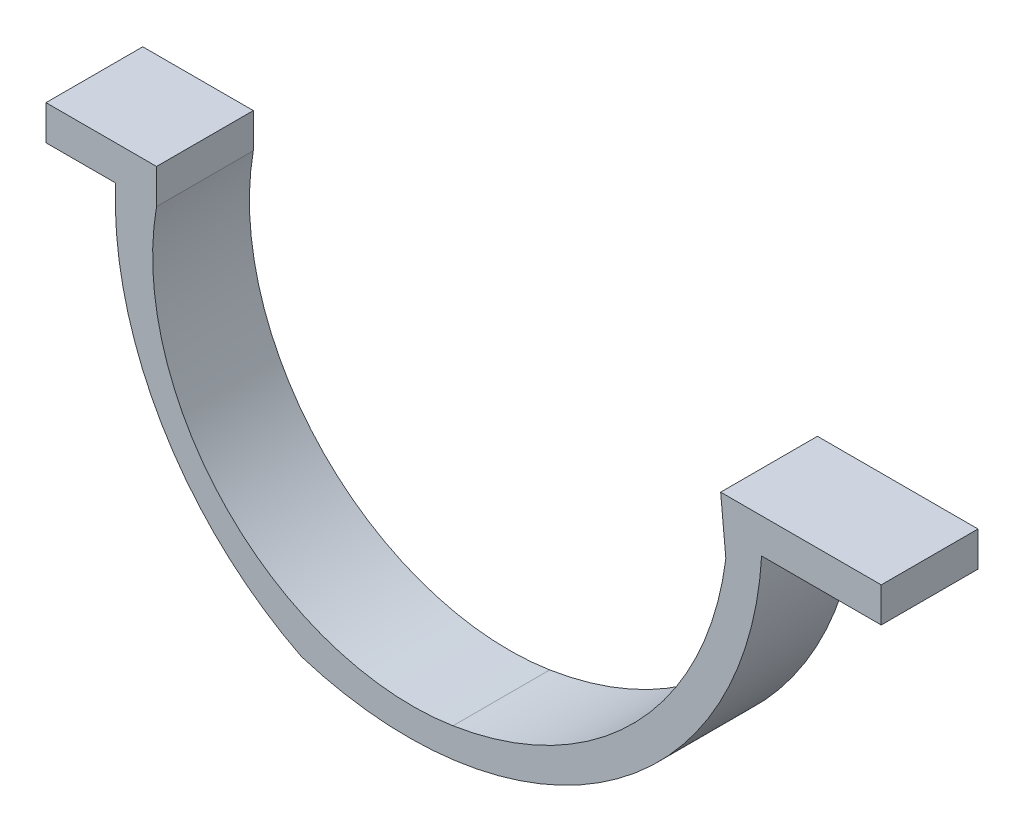
ISO-10303-21;
HEADER;
FILE_DESCRIPTION(('STEP AP214'),'2;1');
FILE_NAME('part.step','',(''),(''),'','','');
FILE_SCHEMA(('AUTOMOTIVE_DESIGN { 1 0 10303 214 1 1 1 1 }'));
ENDSEC;
DATA;
#1=APPLICATION_CONTEXT('core data for automotive mechanical design processes');
#2=APPLICATION_PROTOCOL_DEFINITION('international standard','automotive_design',2000,#1);
#3=PRODUCT_CONTEXT('',#1,'mechanical');
#4=PRODUCT('Part','Part','',(#3));
#5=PRODUCT_RELATED_PRODUCT_CATEGORY('part','',(#4));
#6=PRODUCT_DEFINITION_FORMATION('','',#4);
#7=PRODUCT_DEFINITION_CONTEXT('part definition',#1,'design');
#8=PRODUCT_DEFINITION('design','',#6,#7);
#9=PRODUCT_DEFINITION_SHAPE('','',#8);
#10=(LENGTH_UNIT() NAMED_UNIT(*) SI_UNIT(.MILLI.,.METRE.));
#11=(NAMED_UNIT(*) PLANE_ANGLE_UNIT() SI_UNIT($,.RADIAN.));
#12=(NAMED_UNIT(*) SI_UNIT($,.STERADIAN.) SOLID_ANGLE_UNIT());
#13=UNCERTAINTY_MEASURE_WITH_UNIT(LENGTH_MEASURE(1.E-05),#10,'distance_accuracy_value','');
#14=(GEOMETRIC_REPRESENTATION_CONTEXT(3) GLOBAL_UNCERTAINTY_ASSIGNED_CONTEXT((#13)) GLOBAL_UNIT_ASSIGNED_CONTEXT((#10,
#11,#12)) REPRESENTATION_CONTEXT('',''));
#15=CARTESIAN_POINT('',(0.,0.,0.));
#16=DIRECTION('',(0.,0.,1.));
#17=DIRECTION('',(1.,0.,0.));
#18=AXIS2_PLACEMENT_3D('',#15,#16,#17);
#19=CARTESIAN_POINT('',(-36.5486904215204,2.13660271873455,5.));
#20=DIRECTION('',(0.,0.,-1.));
#21=DIRECTION('',(-1.,0.,0.));
#22=AXIS2_PLACEMENT_3D('',#19,#20,#21);
#23=CYLINDRICAL_SURFACE('',#22,36.6110890674648);
#24=CARTESIAN_POINT('',(-36.5486904215204,2.13660271873455,-5.));
#25=DIRECTION('',(0.,0.,1.));
#26=DIRECTION('',(-1.,0.,0.));
#27=AXIS2_PLACEMENT_3D('',#24,#25,#26);
#28=CIRCLE('',#27,36.6110890674648);
#29=CARTESIAN_POINT('',(-47.563771696846,-32.7781481353646,-5.));
#30=VERTEX_POINT('',#29);
#31=CARTESIAN_POINT('',(0.,0.,-5.));
#32=VERTEX_POINT('',#31);
#33=EDGE_CURVE('E153',#30,#32,#28,.T.);
#34=ORIENTED_EDGE('',*,*,#33,.T.);
#35=DIRECTION('',(0.,0.,-1.));
#36=VECTOR('',#35,1.);
#37=CARTESIAN_POINT('',(0.,0.,5.));
#38=LINE('',#37,#36);
#39=CARTESIAN_POINT('',(0.,0.,5.));
#40=VERTEX_POINT('',#39);
#41=EDGE_CURVE('E11',#40,#32,#38,.T.);
#42=ORIENTED_EDGE('',*,*,#41,.F.);
#43=CARTESIAN_POINT('',(-36.5486904215204,2.13660271873455,5.));
#44=DIRECTION('',(0.,0.,1.));
#45=DIRECTION('',(-1.,0.,0.));
#46=AXIS2_PLACEMENT_3D('',#43,#44,#45);
#47=CIRCLE('',#46,36.6110890674648);
#48=CARTESIAN_POINT('',(-47.563771696846,-32.7781481353646,5.));
#49=VERTEX_POINT('',#48);
#50=EDGE_CURVE('E175',#49,#40,#47,.T.);
#51=ORIENTED_EDGE('',*,*,#50,.F.);
#52=DIRECTION('',(0.,0.,-1.));
#53=VECTOR('',#52,1.);
#54=CARTESIAN_POINT('',(-47.563771696846,-32.7781481353646,5.));
#55=LINE('',#54,#53);
#56=EDGE_CURVE('E149',#49,#30,#55,.T.);
#57=ORIENTED_EDGE('',*,*,#56,.T.);
#58=EDGE_LOOP('',(#34,#42,#51,#57));
#59=FACE_BOUND('',#58,.T.);
#60=ADVANCED_FACE('F33',(#59),#23,.T.);
#61=CARTESIAN_POINT('',(0.,0.,5.));
#62=DIRECTION('',(0.,1.,0.));
#63=DIRECTION('',(0.,0.,1.));
#64=AXIS2_PLACEMENT_3D('',#61,#62,#63);
#65=PLANE('',#64);
#66=DIRECTION('',(1.,0.,0.));
#67=VECTOR('',#66,1.);
#68=CARTESIAN_POINT('',(0.,0.,-5.));
#69=LINE('',#68,#67);
#70=CARTESIAN_POINT('',(12.356704666849,0.,-5.));
#71=VERTEX_POINT('',#70);
#72=EDGE_CURVE('E156',#32,#71,#69,.T.);
#73=ORIENTED_EDGE('',*,*,#72,.T.);
#74=DIRECTION('',(0.,0.,-1.));
#75=VECTOR('',#74,1.);
#76=CARTESIAN_POINT('',(12.356704666849,0.,5.));
#77=LINE('',#76,#75);
#78=CARTESIAN_POINT('',(12.356704666849,0.,5.));
#79=VERTEX_POINT('',#78);
#80=EDGE_CURVE('E41',#79,#71,#77,.T.);
#81=ORIENTED_EDGE('',*,*,#80,.F.);
#82=DIRECTION('',(1.,0.,0.));
#83=VECTOR('',#82,1.);
#84=CARTESIAN_POINT('',(0.,0.,5.));
#85=LINE('',#84,#83);
#86=EDGE_CURVE('E104',#40,#79,#85,.T.);
#87=ORIENTED_EDGE('',*,*,#86,.F.);
#88=ORIENTED_EDGE('',*,*,#41,.T.);
#89=EDGE_LOOP('',(#73,#81,#87,#88));
#90=FACE_BOUND('',#89,.T.);
#91=ADVANCED_FACE('F253',(#90),#65,.F.);
#92=CARTESIAN_POINT('',(12.356704666849,0.,5.));
#93=DIRECTION('',(-1.,0.,0.));
#94=DIRECTION('',(0.,0.,1.));
#95=AXIS2_PLACEMENT_3D('',#92,#93,#94);
#96=PLANE('',#95);
#97=DIRECTION('',(0.,1.,0.));
#98=VECTOR('',#97,1.);
#99=CARTESIAN_POINT('',(12.356704666849,0.,-5.));
#100=LINE('',#99,#98);
#101=CARTESIAN_POINT('',(12.356704666849,3.59517495812955,-5.));
#102=VERTEX_POINT('',#101);
#103=EDGE_CURVE('E158',#71,#102,#100,.T.);
#104=ORIENTED_EDGE('',*,*,#103,.T.);
#105=DIRECTION('',(0.,0.,-1.));
#106=VECTOR('',#105,1.);
#107=CARTESIAN_POINT('',(12.356704666849,3.59517495812955,5.));
#108=LINE('',#107,#106);
#109=CARTESIAN_POINT('',(12.356704666849,3.59517495812955,5.));
#110=VERTEX_POINT('',#109);
#111=EDGE_CURVE('E194',#110,#102,#108,.T.);
#112=ORIENTED_EDGE('',*,*,#111,.F.);
#113=DIRECTION('',(0.,1.,0.));
#114=VECTOR('',#113,1.);
#115=CARTESIAN_POINT('',(12.356704666849,0.,5.));
#116=LINE('',#115,#114);
#117=EDGE_CURVE('E202',#79,#110,#116,.T.);
#118=ORIENTED_EDGE('',*,*,#117,.F.);
#119=ORIENTED_EDGE('',*,*,#80,.T.);
#120=EDGE_LOOP('',(#104,#112,#118,#119));
#121=FACE_BOUND('',#120,.T.);
#122=ADVANCED_FACE('F200',(#121),#96,.F.);
#123=CARTESIAN_POINT('',(12.356704666849,3.59517495812955,5.));
#124=DIRECTION('',(0.,-1.,0.));
#125=DIRECTION('',(1.,0.,0.));
#126=AXIS2_PLACEMENT_3D('',#123,#124,#125);
#127=PLANE('',#126);
#128=DIRECTION('',(-1.,0.,0.));
#129=VECTOR('',#128,1.);
#130=CARTESIAN_POINT('',(12.356704666849,3.59517495812955,-5.));
#131=LINE('',#130,#129);
#132=CARTESIAN_POINT('',(-4.23397636636532,3.59517495812955,-5.));
#133=VERTEX_POINT('',#132);
#134=EDGE_CURVE('E160',#102,#133,#131,.T.);
#135=ORIENTED_EDGE('',*,*,#134,.T.);
#136=DIRECTION('',(0.,0.,-1.));
#137=VECTOR('',#136,1.);
#138=CARTESIAN_POINT('',(-4.23397636636532,3.59517495812955,5.));
#139=LINE('',#138,#137);
#140=CARTESIAN_POINT('',(-4.23397636636532,3.59517495812955,5.));
#141=VERTEX_POINT('',#140);
#142=EDGE_CURVE('E191',#141,#133,#139,.T.);
#143=ORIENTED_EDGE('',*,*,#142,.F.);
#144=DIRECTION('',(-1.,0.,0.));
#145=VECTOR('',#144,1.);
#146=CARTESIAN_POINT('',(12.356704666849,3.59517495812955,5.));
#147=LINE('',#146,#145);
#148=EDGE_CURVE('E220',#110,#141,#147,.T.);
#149=ORIENTED_EDGE('',*,*,#148,.F.);
#150=ORIENTED_EDGE('',*,*,#111,.T.);
#151=EDGE_LOOP('',(#135,#143,#149,#150));
#152=FACE_BOUND('',#151,.T.);
#153=ADVANCED_FACE('F211',(#152),#127,.F.);
#154=CARTESIAN_POINT('',(-4.23397636636532,3.59517495812955,5.));
#155=DIRECTION('',(0.995587275042574,0.0938401714262169,0.));
#156=DIRECTION('',(-0.0938401714262169,0.995587275042574,0.));
#157=AXIS2_PLACEMENT_3D('',#154,#155,#156);
#158=PLANE('',#157);
#159=DIRECTION('',(0.0938401714262169,-0.995587275042574,0.));
#160=VECTOR('',#159,1.);
#161=CARTESIAN_POINT('',(-4.23397636636532,3.59517495812955,-5.));
#162=LINE('',#161,#160);
#163=CARTESIAN_POINT('',(-3.69863307769498,-2.08449247937829,-5.));
#164=VERTEX_POINT('',#163);
#165=EDGE_CURVE('E162',#133,#164,#162,.T.);
#166=ORIENTED_EDGE('',*,*,#165,.T.);
#167=DIRECTION('',(0.,0.,-1.));
#168=VECTOR('',#167,1.);
#169=CARTESIAN_POINT('',(-3.69863307769498,-2.08449247937829,5.));
#170=LINE('',#169,#168);
#171=CARTESIAN_POINT('',(-3.69863307769498,-2.08449247937829,5.));
#172=VERTEX_POINT('',#171);
#173=EDGE_CURVE('E188',#172,#164,#170,.T.);
#174=ORIENTED_EDGE('',*,*,#173,.F.);
#175=DIRECTION('',(0.0938401714262169,-0.995587275042574,0.));
#176=VECTOR('',#175,1.);
#177=CARTESIAN_POINT('',(-4.23397636636532,3.59517495812955,5.));
#178=LINE('',#177,#176);
#179=EDGE_CURVE('E217',#141,#172,#178,.T.);
#180=ORIENTED_EDGE('',*,*,#179,.F.);
#181=ORIENTED_EDGE('',*,*,#142,.T.);
#182=EDGE_LOOP('',(#166,#174,#180,#181));
#183=FACE_BOUND('',#182,.T.);
#184=ADVANCED_FACE('F215',(#183),#158,.F.);
#185=CARTESIAN_POINT('',(-37.1765856640626,2.19206145869411,5.));
#186=DIRECTION('',(0.,0.,-1.));
#187=DIRECTION('',(-1.,0.,0.));
#188=AXIS2_PLACEMENT_3D('',#185,#186,#187);
#189=CYLINDRICAL_SURFACE('',#188,33.7499958957082);
#190=CARTESIAN_POINT('',(-37.1765856640626,2.19206145869411,-5.));
#191=DIRECTION('',(0.,0.,-1.));
#192=DIRECTION('',(-1.,0.,0.));
#193=AXIS2_PLACEMENT_3D('',#190,#191,#192);
#194=CIRCLE('',#193,33.7499958957082);
#195=CARTESIAN_POINT('',(-31.8928290308722,-31.1417672863141,-5.));
#196=VERTEX_POINT('',#195);
#197=EDGE_CURVE('E164',#164,#196,#194,.T.);
#198=ORIENTED_EDGE('',*,*,#197,.T.);
#199=DIRECTION('',(0.,0.,-1.));
#200=VECTOR('',#199,1.);
#201=CARTESIAN_POINT('',(-31.8928290308722,-31.1417672863141,5.));
#202=LINE('',#201,#200);
#203=CARTESIAN_POINT('',(-31.8928290308722,-31.1417672863141,5.));
#204=VERTEX_POINT('',#203);
#205=EDGE_CURVE('E185',#204,#196,#202,.T.);
#206=ORIENTED_EDGE('',*,*,#205,.F.);
#207=CARTESIAN_POINT('',(-37.1765856640626,2.19206145869411,5.));
#208=DIRECTION('',(0.,0.,-1.));
#209=DIRECTION('',(-1.,0.,0.));
#210=AXIS2_PLACEMENT_3D('',#207,#208,#209);
#211=CIRCLE('',#210,33.7499958957082);
#212=EDGE_CURVE('E219',#172,#204,#211,.T.);
#213=ORIENTED_EDGE('',*,*,#212,.F.);
#214=ORIENTED_EDGE('',*,*,#173,.T.);
#215=EDGE_LOOP('',(#198,#206,#213,#214));
#216=FACE_BOUND('',#215,.T.);
#217=ADVANCED_FACE('F266',(#216),#189,.F.);
#218=CARTESIAN_POINT('',(-36.0938283681848,-4.63876909971591,5.));
#219=DIRECTION('',(0.,0.,-1.));
#220=DIRECTION('',(-1.,0.,0.));
#221=AXIS2_PLACEMENT_3D('',#218,#219,#220);
#222=CYLINDRICAL_SURFACE('',#221,26.8338835860732);
#223=CARTESIAN_POINT('',(-36.0938283681848,-4.63876909971591,-5.));
#224=DIRECTION('',(0.,0.,-1.));
#225=DIRECTION('',(-1.,0.,0.));
#226=AXIS2_PLACEMENT_3D('',#223,#224,#225);
#227=CIRCLE('',#226,26.8338835860732);
#228=CARTESIAN_POINT('',(-62.523719203193,0.,-5.));
#229=VERTEX_POINT('',#228);
#230=EDGE_CURVE('E166',#196,#229,#227,.T.);
#231=ORIENTED_EDGE('',*,*,#230,.T.);
#232=DIRECTION('',(0.,0.,-1.));
#233=VECTOR('',#232,1.);
#234=CARTESIAN_POINT('',(-62.523719203193,0.,5.));
#235=LINE('',#234,#233);
#236=CARTESIAN_POINT('',(-62.523719203193,0.,5.));
#237=VERTEX_POINT('',#236);
#238=EDGE_CURVE('E182',#237,#229,#235,.T.);
#239=ORIENTED_EDGE('',*,*,#238,.F.);
#240=CARTESIAN_POINT('',(-36.0938283681848,-4.63876909971591,5.));
#241=DIRECTION('',(0.,0.,-1.));
#242=DIRECTION('',(-1.,0.,0.));
#243=AXIS2_PLACEMENT_3D('',#240,#241,#242);
#244=CIRCLE('',#243,26.8338835860732);
#245=EDGE_CURVE('E222',#204,#237,#244,.T.);
#246=ORIENTED_EDGE('',*,*,#245,.F.);
#247=ORIENTED_EDGE('',*,*,#205,.T.);
#248=EDGE_LOOP('',(#231,#239,#246,#247));
#249=FACE_BOUND('',#248,.T.);
#250=ADVANCED_FACE('F269',(#249),#222,.F.);
#251=CARTESIAN_POINT('',(-62.523719203193,0.,5.));
#252=DIRECTION('',(-1.,0.,0.));
#253=DIRECTION('',(0.,0.,1.));
#254=AXIS2_PLACEMENT_3D('',#251,#252,#253);
#255=PLANE('',#254);
#256=DIRECTION('',(0.,1.,0.));
#257=VECTOR('',#256,1.);
#258=CARTESIAN_POINT('',(-62.523719203193,0.,-5.));
#259=LINE('',#258,#257);
#260=CARTESIAN_POINT('',(-62.523719203193,3.59517495812954,-5.));
#261=VERTEX_POINT('',#260);
#262=EDGE_CURVE('E168',#229,#261,#259,.T.);
#263=ORIENTED_EDGE('',*,*,#262,.T.);
#264=DIRECTION('',(0.,0.,-1.));
#265=VECTOR('',#264,1.);
#266=CARTESIAN_POINT('',(-62.523719203193,3.59517495812954,5.));
#267=LINE('',#266,#265);
#268=CARTESIAN_POINT('',(-62.523719203193,3.59517495812954,5.));
#269=VERTEX_POINT('',#268);
#270=EDGE_CURVE('E179',#269,#261,#267,.T.);
#271=ORIENTED_EDGE('',*,*,#270,.F.);
#272=DIRECTION('',(0.,1.,0.));
#273=VECTOR('',#272,1.);
#274=CARTESIAN_POINT('',(-62.523719203193,0.,5.));
#275=LINE('',#274,#273);
#276=EDGE_CURVE('E228',#237,#269,#275,.T.);
#277=ORIENTED_EDGE('',*,*,#276,.F.);
#278=ORIENTED_EDGE('',*,*,#238,.T.);
#279=EDGE_LOOP('',(#263,#271,#277,#278));
#280=FACE_BOUND('',#279,.T.);
#281=ADVANCED_FACE('F234',(#280),#255,.F.);
#282=CARTESIAN_POINT('',(-62.523719203193,3.59517495812954,5.));
#283=DIRECTION('',(0.,-1.,0.));
#284=DIRECTION('',(1.,0.,0.));
#285=AXIS2_PLACEMENT_3D('',#282,#283,#284);
#286=PLANE('',#285);
#287=DIRECTION('',(-1.,0.,0.));
#288=VECTOR('',#287,1.);
#289=CARTESIAN_POINT('',(-62.523719203193,3.59517495812954,-5.));
#290=LINE('',#289,#288);
#291=CARTESIAN_POINT('',(-73.9447952685,3.59517495812954,-5.));
#292=VERTEX_POINT('',#291);
#293=EDGE_CURVE('E170',#261,#292,#290,.T.);
#294=ORIENTED_EDGE('',*,*,#293,.T.);
#295=DIRECTION('',(0.,0.,-1.));
#296=VECTOR('',#295,1.);
#297=CARTESIAN_POINT('',(-73.9447952685,3.59517495812954,5.));
#298=LINE('',#297,#296);
#299=CARTESIAN_POINT('',(-73.9447952685,3.59517495812954,5.));
#300=VERTEX_POINT('',#299);
#301=EDGE_CURVE('E144',#300,#292,#298,.T.);
#302=ORIENTED_EDGE('',*,*,#301,.F.);
#303=DIRECTION('',(-1.,0.,0.));
#304=VECTOR('',#303,1.);
#305=CARTESIAN_POINT('',(-62.523719203193,3.59517495812954,5.));
#306=LINE('',#305,#304);
#307=EDGE_CURVE('E135',#269,#300,#306,.T.);
#308=ORIENTED_EDGE('',*,*,#307,.F.);
#309=ORIENTED_EDGE('',*,*,#270,.T.);
#310=EDGE_LOOP('',(#294,#302,#308,#309));
#311=FACE_BOUND('',#310,.T.);
#312=ADVANCED_FACE('F238',(#311),#286,.F.);
#313=CARTESIAN_POINT('',(-73.9447952685,3.59517495812954,5.));
#314=DIRECTION('',(1.,0.,0.));
#315=DIRECTION('',(0.,0.,-1.));
#316=AXIS2_PLACEMENT_3D('',#313,#314,#315);
#317=PLANE('',#316);
#318=DIRECTION('',(0.,-1.,0.));
#319=VECTOR('',#318,1.);
#320=CARTESIAN_POINT('',(-73.9447952685,3.59517495812954,-5.));
#321=LINE('',#320,#319);
#322=CARTESIAN_POINT('',(-73.9447952685,0.,-5.));
#323=VERTEX_POINT('',#322);
#324=EDGE_CURVE('E143',#292,#323,#321,.T.);
#325=ORIENTED_EDGE('',*,*,#324,.T.);
#326=DIRECTION('',(0.,0.,-1.));
#327=VECTOR('',#326,1.);
#328=CARTESIAN_POINT('',(-73.9447952685,0.,5.));
#329=LINE('',#328,#327);
#330=CARTESIAN_POINT('',(-73.9447952685,0.,5.));
#331=VERTEX_POINT('',#330);
#332=EDGE_CURVE('E140',#331,#323,#329,.T.);
#333=ORIENTED_EDGE('',*,*,#332,.F.);
#334=DIRECTION('',(0.,-1.,0.));
#335=VECTOR('',#334,1.);
#336=CARTESIAN_POINT('',(-73.9447952685,3.59517495812954,5.));
#337=LINE('',#336,#335);
#338=EDGE_CURVE('E129',#300,#331,#337,.T.);
#339=ORIENTED_EDGE('',*,*,#338,.F.);
#340=ORIENTED_EDGE('',*,*,#301,.T.);
#341=EDGE_LOOP('',(#325,#333,#339,#340));
#342=FACE_BOUND('',#341,.T.);
#343=ADVANCED_FACE('F141',(#342),#317,.F.);
#344=CARTESIAN_POINT('',(-73.9447952685,0.,5.));
#345=DIRECTION('',(0.,1.,0.));
#346=DIRECTION('',(0.,0.,1.));
#347=AXIS2_PLACEMENT_3D('',#344,#345,#346);
#348=PLANE('',#347);
#349=DIRECTION('',(1.,0.,0.));
#350=VECTOR('',#349,1.);
#351=CARTESIAN_POINT('',(-73.9447952685,0.,-5.));
#352=LINE('',#351,#350);
#353=CARTESIAN_POINT('',(-66.7533368009924,0.,-5.));
#354=VERTEX_POINT('',#353);
#355=EDGE_CURVE('E90',#323,#354,#352,.T.);
#356=ORIENTED_EDGE('',*,*,#355,.T.);
#357=DIRECTION('',(0.,0.,-1.));
#358=VECTOR('',#357,1.);
#359=CARTESIAN_POINT('',(-66.7533368009924,0.,5.));
#360=LINE('',#359,#358);
#361=CARTESIAN_POINT('',(-66.7533368009924,0.,5.));
#362=VERTEX_POINT('',#361);
#363=EDGE_CURVE('E145',#362,#354,#360,.T.);
#364=ORIENTED_EDGE('',*,*,#363,.F.);
#365=DIRECTION('',(1.,0.,0.));
#366=VECTOR('',#365,1.);
#367=CARTESIAN_POINT('',(-73.9447952685,0.,5.));
#368=LINE('',#367,#366);
#369=EDGE_CURVE('E133',#331,#362,#368,.T.);
#370=ORIENTED_EDGE('',*,*,#369,.F.);
#371=ORIENTED_EDGE('',*,*,#332,.T.);
#372=EDGE_LOOP('',(#356,#364,#370,#371));
#373=FACE_BOUND('',#372,.T.);
#374=ADVANCED_FACE('F147',(#373),#348,.F.);
#375=CARTESIAN_POINT('',(-31.7468166488898,-1.51208373035663,5.));
#376=DIRECTION('',(0.,0.,-1.));
#377=DIRECTION('',(-1.,0.,0.));
#378=AXIS2_PLACEMENT_3D('',#375,#376,#377);
#379=CYLINDRICAL_SURFACE('',#378,35.0391616675852);
#380=CARTESIAN_POINT('',(-31.7468166488898,-1.51208373035663,-5.));
#381=DIRECTION('',(0.,0.,1.));
#382=DIRECTION('',(-1.,0.,0.));
#383=AXIS2_PLACEMENT_3D('',#380,#381,#382);
#384=CIRCLE('',#383,35.0391616675852);
#385=EDGE_CURVE('E96',#354,#30,#384,.T.);
#386=ORIENTED_EDGE('',*,*,#385,.T.);
#387=ORIENTED_EDGE('',*,*,#56,.F.);
#388=CARTESIAN_POINT('',(-31.7468166488898,-1.51208373035663,5.));
#389=DIRECTION('',(0.,0.,1.));
#390=DIRECTION('',(-1.,0.,0.));
#391=AXIS2_PLACEMENT_3D('',#388,#389,#390);
#392=CIRCLE('',#391,35.0391616675852);
#393=EDGE_CURVE('E49',#362,#49,#392,.T.);
#394=ORIENTED_EDGE('',*,*,#393,.F.);
#395=ORIENTED_EDGE('',*,*,#363,.T.);
#396=EDGE_LOOP('',(#386,#387,#394,#395));
#397=FACE_BOUND('',#396,.T.);
#398=ADVANCED_FACE('F242',(#397),#379,.T.);
#399=CARTESIAN_POINT('',(-36.5486904215204,2.13660271873455,5.));
#400=DIRECTION('',(0.,0.,-1.));
#401=DIRECTION('',(-1.,0.,0.));
#402=AXIS2_PLACEMENT_3D('',#399,#400,#401);
#403=PLANE('',#402);
#404=ORIENTED_EDGE('',*,*,#50,.T.);
#405=ORIENTED_EDGE('',*,*,#86,.T.);
#406=ORIENTED_EDGE('',*,*,#117,.T.);
#407=ORIENTED_EDGE('',*,*,#148,.T.);
#408=ORIENTED_EDGE('',*,*,#179,.T.);
#409=ORIENTED_EDGE('',*,*,#212,.T.);
#410=ORIENTED_EDGE('',*,*,#245,.T.);
#411=ORIENTED_EDGE('',*,*,#276,.T.);
#412=ORIENTED_EDGE('',*,*,#307,.T.);
#413=ORIENTED_EDGE('',*,*,#338,.T.);
#414=ORIENTED_EDGE('',*,*,#369,.T.);
#415=ORIENTED_EDGE('',*,*,#393,.T.);
#416=EDGE_LOOP('',(#404,#405,#406,#407,#408,#409,#410,#411,#412,#413,#414,#415));
#417=FACE_BOUND('',#416,.T.);
#418=ADVANCED_FACE('F131',(#417),#403,.F.);
#419=CARTESIAN_POINT('',(-36.5486904215204,2.13660271873455,-5.));
#420=DIRECTION('',(0.,0.,-1.));
#421=DIRECTION('',(-1.,0.,0.));
#422=AXIS2_PLACEMENT_3D('',#419,#420,#421);
#423=PLANE('',#422);
#424=ORIENTED_EDGE('',*,*,#33,.F.);
#425=ORIENTED_EDGE('',*,*,#385,.F.);
#426=ORIENTED_EDGE('',*,*,#355,.F.);
#427=ORIENTED_EDGE('',*,*,#324,.F.);
#428=ORIENTED_EDGE('',*,*,#293,.F.);
#429=ORIENTED_EDGE('',*,*,#262,.F.);
#430=ORIENTED_EDGE('',*,*,#230,.F.);
#431=ORIENTED_EDGE('',*,*,#197,.F.);
#432=ORIENTED_EDGE('',*,*,#165,.F.);
#433=ORIENTED_EDGE('',*,*,#134,.F.);
#434=ORIENTED_EDGE('',*,*,#103,.F.);
#435=ORIENTED_EDGE('',*,*,#72,.F.);
#436=EDGE_LOOP('',(#424,#425,#426,#427,#428,#429,#430,#431,#432,#433,#434,#435));
#437=FACE_BOUND('',#436,.T.);
#438=ADVANCED_FACE('F206',(#437),#423,.T.);
#439=CLOSED_SHELL('',(#60,#91,#122,#153,#184,#217,#250,#281,#312,#343,#374,#398,#418,#438));
#440=MANIFOLD_SOLID_BREP('B2',#439);
#441=ADVANCED_BREP_SHAPE_REPRESENTATION('',(#18,#440),#14);
#442=SHAPE_DEFINITION_REPRESENTATION(#9,#441);
ENDSEC;
END-ISO-10303-21;
